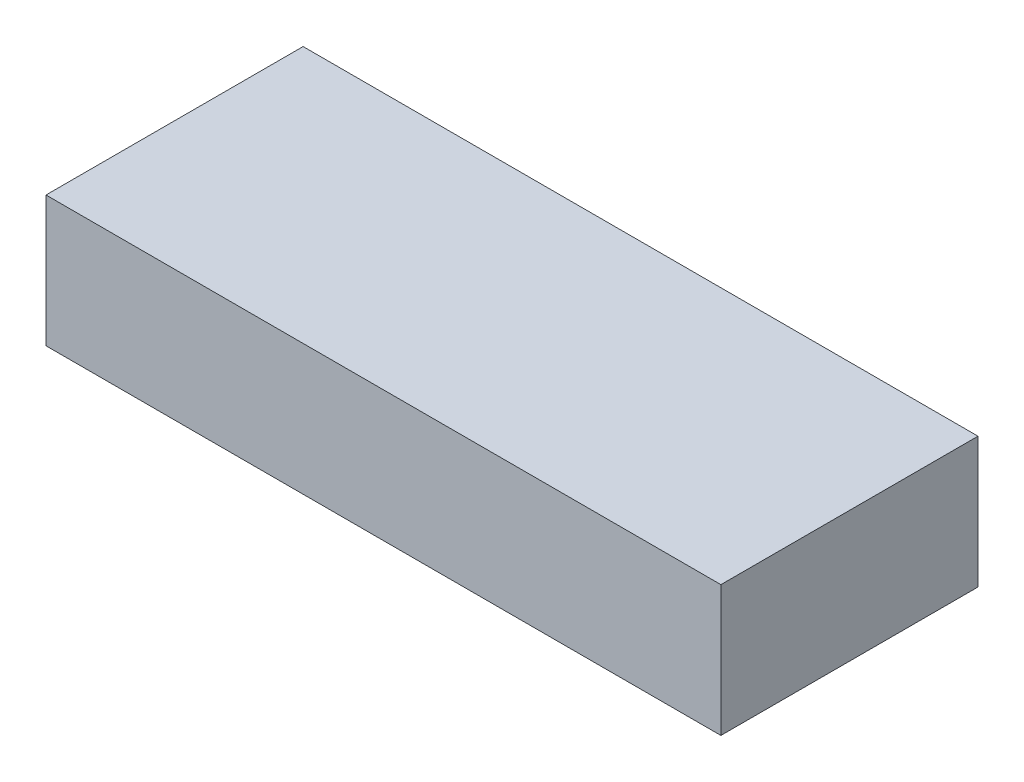
ISO-10303-21;
HEADER;
FILE_DESCRIPTION(('STEP AP214'),'2;1');
FILE_NAME('part.step','',(''),(''),'','','');
FILE_SCHEMA(('AUTOMOTIVE_DESIGN { 1 0 10303 214 1 1 1 1 }'));
ENDSEC;
DATA;
#1=APPLICATION_CONTEXT('core data for automotive mechanical design processes');
#2=APPLICATION_PROTOCOL_DEFINITION('international standard','automotive_design',2000,#1);
#3=PRODUCT_CONTEXT('',#1,'mechanical');
#4=PRODUCT('Part','Part','',(#3));
#5=PRODUCT_RELATED_PRODUCT_CATEGORY('part','',(#4));
#6=PRODUCT_DEFINITION_FORMATION('','',#4);
#7=PRODUCT_DEFINITION_CONTEXT('part definition',#1,'design');
#8=PRODUCT_DEFINITION('design','',#6,#7);
#9=PRODUCT_DEFINITION_SHAPE('','',#8);
#10=(LENGTH_UNIT() NAMED_UNIT(*) SI_UNIT(.MILLI.,.METRE.));
#11=(NAMED_UNIT(*) PLANE_ANGLE_UNIT() SI_UNIT($,.RADIAN.));
#12=(NAMED_UNIT(*) SI_UNIT($,.STERADIAN.) SOLID_ANGLE_UNIT());
#13=UNCERTAINTY_MEASURE_WITH_UNIT(LENGTH_MEASURE(1.E-05),#10,'distance_accuracy_value','');
#14=(GEOMETRIC_REPRESENTATION_CONTEXT(3) GLOBAL_UNCERTAINTY_ASSIGNED_CONTEXT((#13)) GLOBAL_UNIT_ASSIGNED_CONTEXT((#10,
#11,#12)) REPRESENTATION_CONTEXT('',''));
#15=CARTESIAN_POINT('',(0.,0.,0.));
#16=DIRECTION('',(0.,0.,1.));
#17=DIRECTION('',(1.,0.,0.));
#18=AXIS2_PLACEMENT_3D('',#15,#16,#17);
#19=CARTESIAN_POINT('',(-15.5,3.,11.81));
#20=DIRECTION('',(1.,0.,0.));
#21=DIRECTION('',(0.,0.,-1.));
#22=AXIS2_PLACEMENT_3D('',#19,#20,#21);
#23=PLANE('',#22);
#24=DIRECTION('',(0.,-1.,0.));
#25=VECTOR('',#24,1.);
#26=CARTESIAN_POINT('',(-15.5,3.,0.));
#27=LINE('',#26,#25);
#28=CARTESIAN_POINT('',(-15.5,3.,0.));
#29=VERTEX_POINT('',#28);
#30=CARTESIAN_POINT('',(-15.5,-3.,0.));
#31=VERTEX_POINT('',#30);
#32=EDGE_CURVE('E96',#29,#31,#27,.T.);
#33=ORIENTED_EDGE('',*,*,#32,.T.);
#34=DIRECTION('',(0.,0.,-1.));
#35=VECTOR('',#34,1.);
#36=CARTESIAN_POINT('',(-15.5,-3.,11.81));
#37=LINE('',#36,#35);
#38=CARTESIAN_POINT('',(-15.5,-3.,11.81));
#39=VERTEX_POINT('',#38);
#40=EDGE_CURVE('E11',#39,#31,#37,.T.);
#41=ORIENTED_EDGE('',*,*,#40,.F.);
#42=DIRECTION('',(0.,-1.,0.));
#43=VECTOR('',#42,1.);
#44=CARTESIAN_POINT('',(-15.5,3.,11.81));
#45=LINE('',#44,#43);
#46=CARTESIAN_POINT('',(-15.5,3.,11.81));
#47=VERTEX_POINT('',#46);
#48=EDGE_CURVE('E84',#47,#39,#45,.T.);
#49=ORIENTED_EDGE('',*,*,#48,.F.);
#50=DIRECTION('',(0.,0.,-1.));
#51=VECTOR('',#50,1.);
#52=CARTESIAN_POINT('',(-15.5,3.,11.81));
#53=LINE('',#52,#51);
#54=EDGE_CURVE('E92',#47,#29,#53,.T.);
#55=ORIENTED_EDGE('',*,*,#54,.T.);
#56=EDGE_LOOP('',(#33,#41,#49,#55));
#57=FACE_BOUND('',#56,.T.);
#58=ADVANCED_FACE('F33',(#57),#23,.F.);
#59=CARTESIAN_POINT('',(-15.5,-3.,11.81));
#60=DIRECTION('',(0.,1.,0.));
#61=DIRECTION('',(0.,0.,1.));
#62=AXIS2_PLACEMENT_3D('',#59,#60,#61);
#63=PLANE('',#62);
#64=DIRECTION('',(1.,0.,0.));
#65=VECTOR('',#64,1.);
#66=CARTESIAN_POINT('',(-15.5,-3.,0.));
#67=LINE('',#66,#65);
#68=CARTESIAN_POINT('',(15.5,-3.,0.));
#69=VERTEX_POINT('',#68);
#70=EDGE_CURVE('E88',#31,#69,#67,.T.);
#71=ORIENTED_EDGE('',*,*,#70,.T.);
#72=DIRECTION('',(0.,0.,-1.));
#73=VECTOR('',#72,1.);
#74=CARTESIAN_POINT('',(15.5,-3.,11.81));
#75=LINE('',#74,#73);
#76=CARTESIAN_POINT('',(15.5,-3.,11.81));
#77=VERTEX_POINT('',#76);
#78=EDGE_CURVE('E41',#77,#69,#75,.T.);
#79=ORIENTED_EDGE('',*,*,#78,.F.);
#80=DIRECTION('',(1.,0.,0.));
#81=VECTOR('',#80,1.);
#82=CARTESIAN_POINT('',(-15.5,-3.,11.81));
#83=LINE('',#82,#81);
#84=EDGE_CURVE('E79',#39,#77,#83,.T.);
#85=ORIENTED_EDGE('',*,*,#84,.F.);
#86=ORIENTED_EDGE('',*,*,#40,.T.);
#87=EDGE_LOOP('',(#71,#79,#85,#86));
#88=FACE_BOUND('',#87,.T.);
#89=ADVANCED_FACE('F87',(#88),#63,.F.);
#90=CARTESIAN_POINT('',(15.5,-3.,11.81));
#91=DIRECTION('',(-1.,0.,0.));
#92=DIRECTION('',(0.,0.,1.));
#93=AXIS2_PLACEMENT_3D('',#90,#91,#92);
#94=PLANE('',#93);
#95=DIRECTION('',(0.,1.,0.));
#96=VECTOR('',#95,1.);
#97=CARTESIAN_POINT('',(15.5,-3.,0.));
#98=LINE('',#97,#96);
#99=CARTESIAN_POINT('',(15.5,3.,0.));
#100=VERTEX_POINT('',#99);
#101=EDGE_CURVE('E66',#69,#100,#98,.T.);
#102=ORIENTED_EDGE('',*,*,#101,.T.);
#103=DIRECTION('',(0.,0.,-1.));
#104=VECTOR('',#103,1.);
#105=CARTESIAN_POINT('',(15.5,3.,11.81));
#106=LINE('',#105,#104);
#107=CARTESIAN_POINT('',(15.5,3.,11.81));
#108=VERTEX_POINT('',#107);
#109=EDGE_CURVE('E89',#108,#100,#106,.T.);
#110=ORIENTED_EDGE('',*,*,#109,.F.);
#111=DIRECTION('',(0.,1.,0.));
#112=VECTOR('',#111,1.);
#113=CARTESIAN_POINT('',(15.5,-3.,11.81));
#114=LINE('',#113,#112);
#115=EDGE_CURVE('E82',#77,#108,#114,.T.);
#116=ORIENTED_EDGE('',*,*,#115,.F.);
#117=ORIENTED_EDGE('',*,*,#78,.T.);
#118=EDGE_LOOP('',(#102,#110,#116,#117));
#119=FACE_BOUND('',#118,.T.);
#120=ADVANCED_FACE('F90',(#119),#94,.F.);
#121=CARTESIAN_POINT('',(15.5,3.,11.81));
#122=DIRECTION('',(0.,-1.,0.));
#123=DIRECTION('',(0.,0.,-1.));
#124=AXIS2_PLACEMENT_3D('',#121,#122,#123);
#125=PLANE('',#124);
#126=DIRECTION('',(-1.,0.,0.));
#127=VECTOR('',#126,1.);
#128=CARTESIAN_POINT('',(15.5,3.,0.));
#129=LINE('',#128,#127);
#130=EDGE_CURVE('E72',#100,#29,#129,.T.);
#131=ORIENTED_EDGE('',*,*,#130,.T.);
#132=ORIENTED_EDGE('',*,*,#54,.F.);
#133=DIRECTION('',(-1.,0.,0.));
#134=VECTOR('',#133,1.);
#135=CARTESIAN_POINT('',(15.5,3.,11.81));
#136=LINE('',#135,#134);
#137=EDGE_CURVE('E49',#108,#47,#136,.T.);
#138=ORIENTED_EDGE('',*,*,#137,.F.);
#139=ORIENTED_EDGE('',*,*,#109,.T.);
#140=EDGE_LOOP('',(#131,#132,#138,#139));
#141=FACE_BOUND('',#140,.T.);
#142=ADVANCED_FACE('F103',(#141),#125,.F.);
#143=CARTESIAN_POINT('',(0.,0.,11.81));
#144=DIRECTION('',(0.,0.,1.));
#145=DIRECTION('',(1.,0.,0.));
#146=AXIS2_PLACEMENT_3D('',#143,#144,#145);
#147=PLANE('',#146);
#148=ORIENTED_EDGE('',*,*,#48,.T.);
#149=ORIENTED_EDGE('',*,*,#84,.T.);
#150=ORIENTED_EDGE('',*,*,#115,.T.);
#151=ORIENTED_EDGE('',*,*,#137,.T.);
#152=EDGE_LOOP('',(#148,#149,#150,#151));
#153=FACE_BOUND('',#152,.T.);
#154=ADVANCED_FACE('F80',(#153),#147,.T.);
#155=CARTESIAN_POINT('',(0.,0.,0.));
#156=DIRECTION('',(0.,0.,1.));
#157=DIRECTION('',(1.,0.,0.));
#158=AXIS2_PLACEMENT_3D('',#155,#156,#157);
#159=PLANE('',#158);
#160=ORIENTED_EDGE('',*,*,#32,.F.);
#161=ORIENTED_EDGE('',*,*,#130,.F.);
#162=ORIENTED_EDGE('',*,*,#101,.F.);
#163=ORIENTED_EDGE('',*,*,#70,.F.);
#164=EDGE_LOOP('',(#160,#161,#162,#163));
#165=FACE_BOUND('',#164,.T.);
#166=ADVANCED_FACE('F106',(#165),#159,.F.);
#167=CLOSED_SHELL('',(#58,#89,#120,#142,#154,#166));
#168=MANIFOLD_SOLID_BREP('B2',#167);
#169=ADVANCED_BREP_SHAPE_REPRESENTATION('',(#18,#168),#14);
#170=SHAPE_DEFINITION_REPRESENTATION(#9,#169);
ENDSEC;
END-ISO-10303-21;
